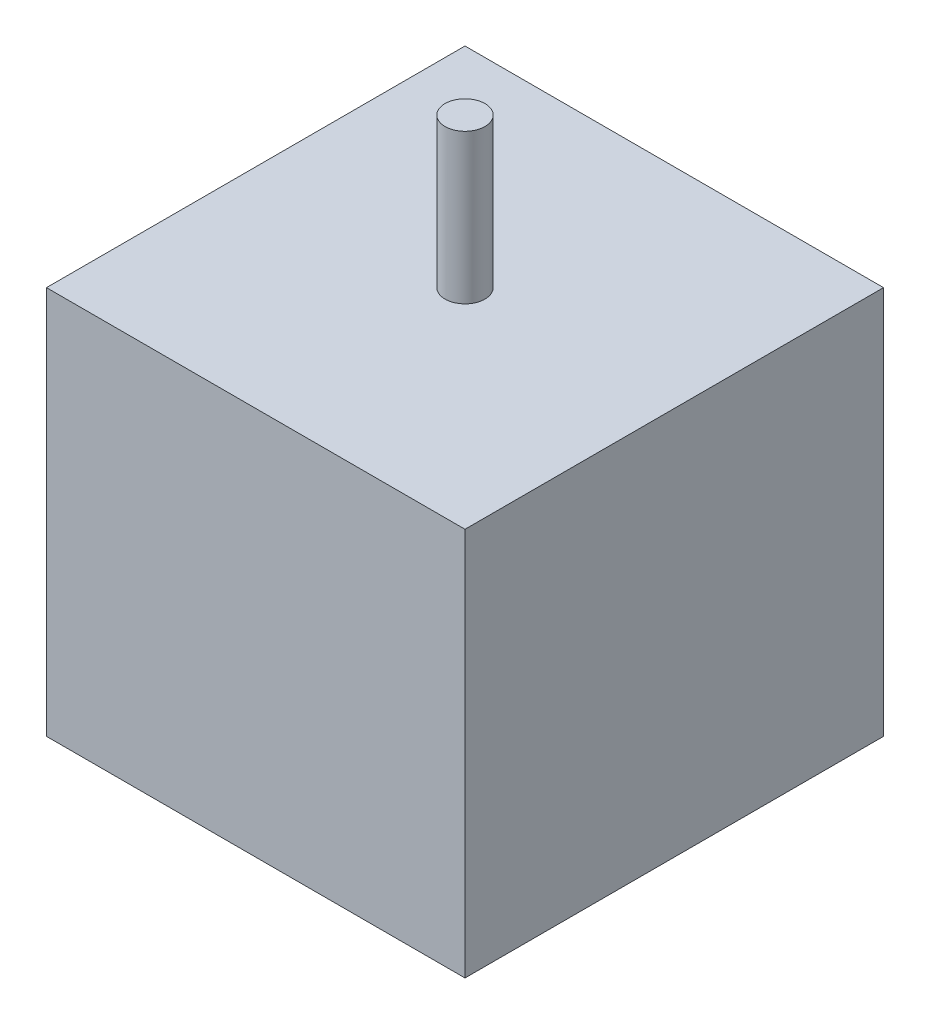
ISO-10303-21;
HEADER;
FILE_DESCRIPTION(('STEP AP214'),'2;1');
FILE_NAME('part.step','',(''),(''),'','','');
FILE_SCHEMA(('AUTOMOTIVE_DESIGN { 1 0 10303 214 1 1 1 1 }'));
ENDSEC;
DATA;
#1=APPLICATION_CONTEXT('core data for automotive mechanical design processes');
#2=APPLICATION_PROTOCOL_DEFINITION('international standard','automotive_design',2000,#1);
#3=PRODUCT_CONTEXT('',#1,'mechanical');
#4=PRODUCT('Part','Part','',(#3));
#5=PRODUCT_RELATED_PRODUCT_CATEGORY('part','',(#4));
#6=PRODUCT_DEFINITION_FORMATION('','',#4);
#7=PRODUCT_DEFINITION_CONTEXT('part definition',#1,'design');
#8=PRODUCT_DEFINITION('design','',#6,#7);
#9=PRODUCT_DEFINITION_SHAPE('','',#8);
#10=(LENGTH_UNIT() NAMED_UNIT(*) SI_UNIT(.MILLI.,.METRE.));
#11=(NAMED_UNIT(*) PLANE_ANGLE_UNIT() SI_UNIT($,.RADIAN.));
#12=(NAMED_UNIT(*) SI_UNIT($,.STERADIAN.) SOLID_ANGLE_UNIT());
#13=UNCERTAINTY_MEASURE_WITH_UNIT(LENGTH_MEASURE(1.E-05),#10,'distance_accuracy_value','');
#14=(GEOMETRIC_REPRESENTATION_CONTEXT(3) GLOBAL_UNCERTAINTY_ASSIGNED_CONTEXT((#13)) GLOBAL_UNIT_ASSIGNED_CONTEXT((#10,
#11,#12)) REPRESENTATION_CONTEXT('',''));
#15=CARTESIAN_POINT('',(0.,0.,0.));
#16=DIRECTION('',(0.,0.,1.));
#17=DIRECTION('',(1.,0.,0.));
#18=AXIS2_PLACEMENT_3D('',#15,#16,#17);
#19=CARTESIAN_POINT('',(21.,39.,21.));
#20=DIRECTION('',(-1.,0.,0.));
#21=DIRECTION('',(0.,0.,1.));
#22=AXIS2_PLACEMENT_3D('',#19,#20,#21);
#23=PLANE('',#22);
#24=DIRECTION('',(0.,0.,-1.));
#25=VECTOR('',#24,1.);
#26=CARTESIAN_POINT('',(21.,0.,21.));
#27=LINE('',#26,#25);
#28=CARTESIAN_POINT('',(21.,0.,21.));
#29=VERTEX_POINT('',#28);
#30=CARTESIAN_POINT('',(21.,0.,-21.));
#31=VERTEX_POINT('',#30);
#32=EDGE_CURVE('E103',#29,#31,#27,.T.);
#33=ORIENTED_EDGE('',*,*,#32,.T.);
#34=DIRECTION('',(0.,-1.,0.));
#35=VECTOR('',#34,1.);
#36=CARTESIAN_POINT('',(21.,39.,-21.));
#37=LINE('',#36,#35);
#38=CARTESIAN_POINT('',(21.,39.,-21.));
#39=VERTEX_POINT('',#38);
#40=EDGE_CURVE('E45',#39,#31,#37,.T.);
#41=ORIENTED_EDGE('',*,*,#40,.F.);
#42=DIRECTION('',(0.,0.,-1.));
#43=VECTOR('',#42,1.);
#44=CARTESIAN_POINT('',(21.,39.,21.));
#45=LINE('',#44,#43);
#46=CARTESIAN_POINT('',(21.,39.,21.));
#47=VERTEX_POINT('',#46);
#48=EDGE_CURVE('E89',#47,#39,#45,.T.);
#49=ORIENTED_EDGE('',*,*,#48,.F.);
#50=DIRECTION('',(0.,-1.,0.));
#51=VECTOR('',#50,1.);
#52=CARTESIAN_POINT('',(21.,39.,21.));
#53=LINE('',#52,#51);
#54=EDGE_CURVE('E99',#47,#29,#53,.T.);
#55=ORIENTED_EDGE('',*,*,#54,.T.);
#56=EDGE_LOOP('',(#33,#41,#49,#55));
#57=FACE_BOUND('',#56,.T.);
#58=ADVANCED_FACE('F37',(#57),#23,.F.);
#59=CARTESIAN_POINT('',(-21.,39.,-21.));
#60=DIRECTION('',(0.,0.,1.));
#61=DIRECTION('',(1.,0.,0.));
#62=AXIS2_PLACEMENT_3D('',#59,#60,#61);
#63=PLANE('',#62);
#64=DIRECTION('',(-1.,0.,0.));
#65=VECTOR('',#64,1.);
#66=CARTESIAN_POINT('',(-21.,0.,-21.));
#67=LINE('',#66,#65);
#68=CARTESIAN_POINT('',(-21.,0.,-21.));
#69=VERTEX_POINT('',#68);
#70=EDGE_CURVE('E94',#31,#69,#67,.T.);
#71=ORIENTED_EDGE('',*,*,#70,.T.);
#72=DIRECTION('',(0.,-1.,0.));
#73=VECTOR('',#72,1.);
#74=CARTESIAN_POINT('',(-21.,39.,-21.));
#75=LINE('',#74,#73);
#76=CARTESIAN_POINT('',(-21.,39.,-21.));
#77=VERTEX_POINT('',#76);
#78=EDGE_CURVE('E92',#77,#69,#75,.T.);
#79=ORIENTED_EDGE('',*,*,#78,.F.);
#80=DIRECTION('',(-1.,0.,0.));
#81=VECTOR('',#80,1.);
#82=CARTESIAN_POINT('',(-21.,39.,-21.));
#83=LINE('',#82,#81);
#84=EDGE_CURVE('E84',#39,#77,#83,.T.);
#85=ORIENTED_EDGE('',*,*,#84,.F.);
#86=ORIENTED_EDGE('',*,*,#40,.T.);
#87=EDGE_LOOP('',(#71,#79,#85,#86));
#88=FACE_BOUND('',#87,.T.);
#89=ADVANCED_FACE('F93',(#88),#63,.F.);
#90=CARTESIAN_POINT('',(-21.,39.,21.));
#91=DIRECTION('',(1.,0.,0.));
#92=DIRECTION('',(0.,0.,-1.));
#93=AXIS2_PLACEMENT_3D('',#90,#91,#92);
#94=PLANE('',#93);
#95=DIRECTION('',(0.,0.,1.));
#96=VECTOR('',#95,1.);
#97=CARTESIAN_POINT('',(-21.,0.,21.));
#98=LINE('',#97,#96);
#99=CARTESIAN_POINT('',(-21.,0.,21.));
#100=VERTEX_POINT('',#99);
#101=EDGE_CURVE('E70',#69,#100,#98,.T.);
#102=ORIENTED_EDGE('',*,*,#101,.T.);
#103=DIRECTION('',(0.,-1.,0.));
#104=VECTOR('',#103,1.);
#105=CARTESIAN_POINT('',(-21.,39.,21.));
#106=LINE('',#105,#104);
#107=CARTESIAN_POINT('',(-21.,39.,21.));
#108=VERTEX_POINT('',#107);
#109=EDGE_CURVE('E95',#108,#100,#106,.T.);
#110=ORIENTED_EDGE('',*,*,#109,.F.);
#111=DIRECTION('',(0.,0.,1.));
#112=VECTOR('',#111,1.);
#113=CARTESIAN_POINT('',(-21.,39.,21.));
#114=LINE('',#113,#112);
#115=EDGE_CURVE('E87',#77,#108,#114,.T.);
#116=ORIENTED_EDGE('',*,*,#115,.F.);
#117=ORIENTED_EDGE('',*,*,#78,.T.);
#118=EDGE_LOOP('',(#102,#110,#116,#117));
#119=FACE_BOUND('',#118,.T.);
#120=ADVANCED_FACE('F97',(#119),#94,.F.);
#121=CARTESIAN_POINT('',(-21.,39.,21.));
#122=DIRECTION('',(0.,0.,-1.));
#123=DIRECTION('',(-1.,0.,0.));
#124=AXIS2_PLACEMENT_3D('',#121,#122,#123);
#125=PLANE('',#124);
#126=DIRECTION('',(1.,0.,0.));
#127=VECTOR('',#126,1.);
#128=CARTESIAN_POINT('',(-21.,0.,21.));
#129=LINE('',#128,#127);
#130=EDGE_CURVE('E76',#100,#29,#129,.T.);
#131=ORIENTED_EDGE('',*,*,#130,.T.);
#132=ORIENTED_EDGE('',*,*,#54,.F.);
#133=DIRECTION('',(1.,0.,0.));
#134=VECTOR('',#133,1.);
#135=CARTESIAN_POINT('',(-21.,39.,21.));
#136=LINE('',#135,#134);
#137=EDGE_CURVE('E53',#108,#47,#136,.T.);
#138=ORIENTED_EDGE('',*,*,#137,.F.);
#139=ORIENTED_EDGE('',*,*,#109,.T.);
#140=EDGE_LOOP('',(#131,#132,#138,#139));
#141=FACE_BOUND('',#140,.T.);
#142=ADVANCED_FACE('F125',(#141),#125,.F.);
#143=CARTESIAN_POINT('',(0.,39.,0.));
#144=DIRECTION('',(0.,-1.,0.));
#145=DIRECTION('',(0.,0.,-1.));
#146=AXIS2_PLACEMENT_3D('',#143,#144,#145);
#147=PLANE('',#146);
#148=CARTESIAN_POINT('',(0.,39.,0.));
#149=DIRECTION('',(0.,-1.,0.));
#150=DIRECTION('',(0.,0.,-1.));
#151=AXIS2_PLACEMENT_3D('',#148,#149,#150);
#152=CIRCLE('',#151,2.);
#153=CARTESIAN_POINT('',(0.,39.,-2.));
#154=VERTEX_POINT('',#153);
#155=EDGE_CURVE('E11',#154,#154,#152,.F.);
#156=ORIENTED_EDGE('',*,*,#155,.F.);
#157=EDGE_LOOP('',(#156));
#158=FACE_BOUND('',#157,.T.);
#159=ORIENTED_EDGE('',*,*,#48,.T.);
#160=ORIENTED_EDGE('',*,*,#84,.T.);
#161=ORIENTED_EDGE('',*,*,#115,.T.);
#162=ORIENTED_EDGE('',*,*,#137,.T.);
#163=EDGE_LOOP('',(#159,#160,#161,#162));
#164=FACE_BOUND('',#163,.T.);
#165=ADVANCED_FACE('F85',(#158,#164),#147,.F.);
#166=CARTESIAN_POINT('',(0.,0.,0.));
#167=DIRECTION('',(0.,-1.,0.));
#168=DIRECTION('',(0.,0.,-1.));
#169=AXIS2_PLACEMENT_3D('',#166,#167,#168);
#170=PLANE('',#169);
#171=ORIENTED_EDGE('',*,*,#32,.F.);
#172=ORIENTED_EDGE('',*,*,#130,.F.);
#173=ORIENTED_EDGE('',*,*,#101,.F.);
#174=ORIENTED_EDGE('',*,*,#70,.F.);
#175=EDGE_LOOP('',(#171,#172,#173,#174));
#176=FACE_BOUND('',#175,.T.);
#177=ADVANCED_FACE('F114',(#176),#170,.T.);
#178=CARTESIAN_POINT('',(0.,54.,0.));
#179=DIRECTION('',(0.,-1.,0.));
#180=DIRECTION('',(0.,0.,-1.));
#181=AXIS2_PLACEMENT_3D('',#178,#179,#180);
#182=CYLINDRICAL_SURFACE('',#181,2.);
#183=CARTESIAN_POINT('',(0.,54.,0.));
#184=DIRECTION('',(0.,1.,0.));
#185=DIRECTION('',(0.,0.,1.));
#186=AXIS2_PLACEMENT_3D('',#183,#184,#185);
#187=CIRCLE('',#186,2.);
#188=CARTESIAN_POINT('',(0.,54.,2.));
#189=VERTEX_POINT('',#188);
#190=EDGE_CURVE('E106',#189,#189,#187,.T.);
#191=ORIENTED_EDGE('',*,*,#190,.F.);
#192=EDGE_LOOP('',(#191));
#193=FACE_BOUND('',#192,.T.);
#194=ORIENTED_EDGE('',*,*,#155,.T.);
#195=EDGE_LOOP('',(#194));
#196=FACE_BOUND('',#195,.T.);
#197=ADVANCED_FACE('F116',(#193,#196),#182,.T.);
#198=CARTESIAN_POINT('',(0.,54.,0.));
#199=DIRECTION('',(0.,1.,0.));
#200=DIRECTION('',(0.,0.,1.));
#201=AXIS2_PLACEMENT_3D('',#198,#199,#200);
#202=PLANE('',#201);
#203=ORIENTED_EDGE('',*,*,#190,.T.);
#204=EDGE_LOOP('',(#203));
#205=FACE_BOUND('',#204,.T.);
#206=ADVANCED_FACE('F122',(#205),#202,.T.);
#207=CLOSED_SHELL('',(#58,#89,#120,#142,#165,#177,#197,#206));
#208=MANIFOLD_SOLID_BREP('B2',#207);
#209=ADVANCED_BREP_SHAPE_REPRESENTATION('',(#18,#208),#14);
#210=SHAPE_DEFINITION_REPRESENTATION(#9,#209);
ENDSEC;
END-ISO-10303-21;
